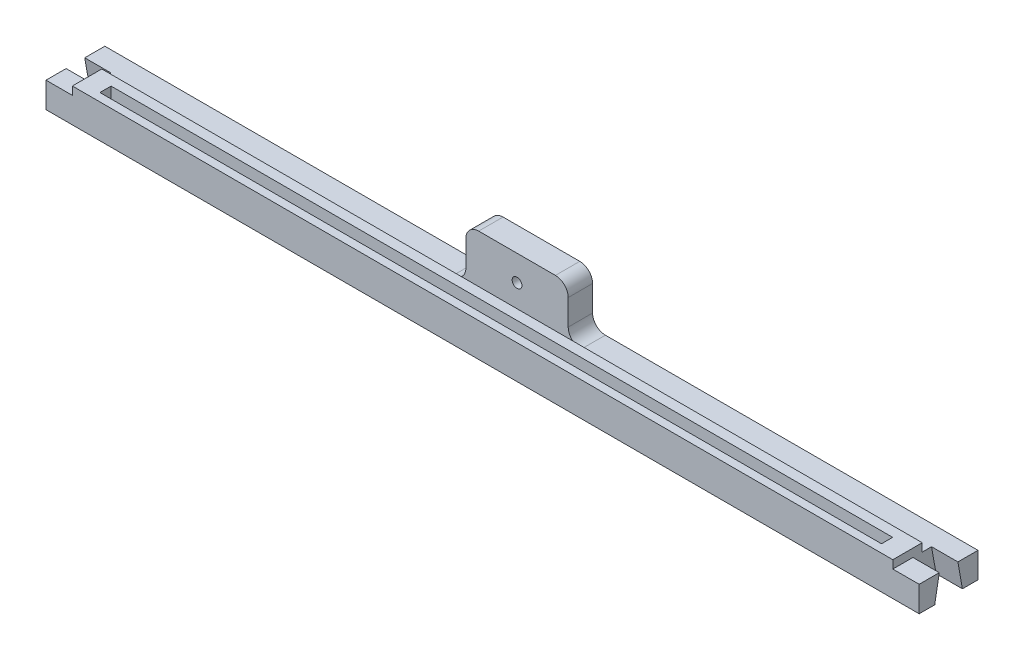
ISO-10303-21;
HEADER;
FILE_DESCRIPTION(('STEP AP214'),'2;1');
FILE_NAME('part.step','',(''),(''),'','','');
FILE_SCHEMA(('AUTOMOTIVE_DESIGN { 1 0 10303 214 1 1 1 1 }'));
ENDSEC;
DATA;
#1=APPLICATION_CONTEXT('core data for automotive mechanical design processes');
#2=APPLICATION_PROTOCOL_DEFINITION('international standard','automotive_design',2000,#1);
#3=PRODUCT_CONTEXT('',#1,'mechanical');
#4=PRODUCT('Part','Part','',(#3));
#5=PRODUCT_RELATED_PRODUCT_CATEGORY('part','',(#4));
#6=PRODUCT_DEFINITION_FORMATION('','',#4);
#7=PRODUCT_DEFINITION_CONTEXT('part definition',#1,'design');
#8=PRODUCT_DEFINITION('design','',#6,#7);
#9=PRODUCT_DEFINITION_SHAPE('','',#8);
#10=(LENGTH_UNIT() NAMED_UNIT(*) SI_UNIT(.MILLI.,.METRE.));
#11=(NAMED_UNIT(*) PLANE_ANGLE_UNIT() SI_UNIT($,.RADIAN.));
#12=(NAMED_UNIT(*) SI_UNIT($,.STERADIAN.) SOLID_ANGLE_UNIT());
#13=UNCERTAINTY_MEASURE_WITH_UNIT(LENGTH_MEASURE(1.E-05),#10,'distance_accuracy_value','');
#14=(GEOMETRIC_REPRESENTATION_CONTEXT(3) GLOBAL_UNCERTAINTY_ASSIGNED_CONTEXT((#13)) GLOBAL_UNIT_ASSIGNED_CONTEXT((#10,
#11,#12)) REPRESENTATION_CONTEXT('',''));
#15=CARTESIAN_POINT('',(0.,0.,0.));
#16=DIRECTION('',(0.,0.,1.));
#17=DIRECTION('',(1.,0.,0.));
#18=AXIS2_PLACEMENT_3D('',#15,#16,#17);
#19=CARTESIAN_POINT('',(0.,20.,0.));
#20=DIRECTION('',(0.,1.,0.));
#21=DIRECTION('',(0.,0.,1.));
#22=AXIS2_PLACEMENT_3D('',#19,#20,#21);
#23=PLANE('',#22);
#24=DIRECTION('',(1.,0.,0.));
#25=VECTOR('',#24,1.);
#26=CARTESIAN_POINT('',(0.,20.,-3.95000000000002));
#27=LINE('',#26,#25);
#28=CARTESIAN_POINT('',(-50.,20.,-3.95000000000002));
#29=VERTEX_POINT('',#28);
#30=CARTESIAN_POINT('',(50.,20.,-3.95000000000002));
#31=VERTEX_POINT('',#30);
#32=EDGE_CURVE('E256',#29,#31,#27,.T.);
#33=ORIENTED_EDGE('',*,*,#32,.F.);
#34=DIRECTION('',(0.,0.,-1.));
#35=VECTOR('',#34,1.);
#36=CARTESIAN_POINT('',(-50.,20.,-23.));
#37=LINE('',#36,#35);
#38=CARTESIAN_POINT('',(-50.,20.,-23.));
#39=VERTEX_POINT('',#38);
#40=EDGE_CURVE('E446',#29,#39,#37,.T.);
#41=ORIENTED_EDGE('',*,*,#40,.T.);
#42=DIRECTION('',(1.,0.,0.));
#43=VECTOR('',#42,1.);
#44=CARTESIAN_POINT('',(0.,20.,-23.));
#45=LINE('',#44,#43);
#46=CARTESIAN_POINT('',(-341.35,20.,-23.));
#47=VERTEX_POINT('',#46);
#48=EDGE_CURVE('E387',#47,#39,#45,.T.);
#49=ORIENTED_EDGE('',*,*,#48,.F.);
#50=DIRECTION('',(0.,0.,1.));
#51=VECTOR('',#50,1.);
#52=CARTESIAN_POINT('',(-341.35,20.,0.));
#53=LINE('',#52,#51);
#54=CARTESIAN_POINT('',(-341.35,20.,-7.291));
#55=VERTEX_POINT('',#54);
#56=EDGE_CURVE('E328',#47,#55,#53,.T.);
#57=ORIENTED_EDGE('',*,*,#56,.T.);
#58=DIRECTION('',(-1.,0.,0.));
#59=VECTOR('',#58,1.);
#60=CARTESIAN_POINT('',(0.,20.,-7.29100000000004));
#61=LINE('',#60,#59);
#62=CARTESIAN_POINT('',(-320.75,20.,-7.291));
#63=VERTEX_POINT('',#62);
#64=EDGE_CURVE('E304',#63,#55,#61,.T.);
#65=ORIENTED_EDGE('',*,*,#64,.F.);
#66=DIRECTION('',(0.,0.,1.));
#67=VECTOR('',#66,1.);
#68=CARTESIAN_POINT('',(-320.75,20.,0.));
#69=LINE('',#68,#67);
#70=CARTESIAN_POINT('',(-320.75,20.,0.));
#71=VERTEX_POINT('',#70);
#72=EDGE_CURVE('E357',#63,#71,#69,.T.);
#73=ORIENTED_EDGE('',*,*,#72,.T.);
#74=DIRECTION('',(-1.,0.,0.));
#75=VECTOR('',#74,1.);
#76=CARTESIAN_POINT('',(0.,20.,0.));
#77=LINE('',#76,#75);
#78=CARTESIAN_POINT('',(320.75,20.,0.));
#79=VERTEX_POINT('',#78);
#80=EDGE_CURVE('E301',#79,#71,#77,.T.);
#81=ORIENTED_EDGE('',*,*,#80,.F.);
#82=DIRECTION('',(0.,0.,1.));
#83=VECTOR('',#82,1.);
#84=CARTESIAN_POINT('',(320.75,20.,0.));
#85=LINE('',#84,#83);
#86=CARTESIAN_POINT('',(320.75,20.,-7.29100000000008));
#87=VERTEX_POINT('',#86);
#88=EDGE_CURVE('E373',#87,#79,#85,.T.);
#89=ORIENTED_EDGE('',*,*,#88,.F.);
#90=DIRECTION('',(1.,0.,0.));
#91=VECTOR('',#90,1.);
#92=CARTESIAN_POINT('',(0.,20.,-7.29100000000005));
#93=LINE('',#92,#91);
#94=CARTESIAN_POINT('',(341.35,20.,-7.29100000000008));
#95=VERTEX_POINT('',#94);
#96=EDGE_CURVE('E376',#87,#95,#93,.T.);
#97=ORIENTED_EDGE('',*,*,#96,.T.);
#98=DIRECTION('',(0.,0.,1.));
#99=VECTOR('',#98,1.);
#100=CARTESIAN_POINT('',(341.35,20.,0.));
#101=LINE('',#100,#99);
#102=CARTESIAN_POINT('',(341.35,20.,-23.));
#103=VERTEX_POINT('',#102);
#104=EDGE_CURVE('E384',#103,#95,#101,.T.);
#105=ORIENTED_EDGE('',*,*,#104,.F.);
#106=CARTESIAN_POINT('',(50.,20.,-23.));
#107=VERTEX_POINT('',#106);
#108=EDGE_CURVE('E386',#107,#103,#45,.T.);
#109=ORIENTED_EDGE('',*,*,#108,.F.);
#110=DIRECTION('',(0.,0.,-1.));
#111=VECTOR('',#110,1.);
#112=CARTESIAN_POINT('',(50.,20.,0.));
#113=LINE('',#112,#111);
#114=EDGE_CURVE('E444',#107,#31,#113,.F.);
#115=ORIENTED_EDGE('',*,*,#114,.T.);
#116=EDGE_LOOP('',(#33,#41,#49,#57,#65,#73,#81,#89,#97,#105,#109,#115));
#117=FACE_BOUND('',#116,.T.);
#118=ADVANCED_FACE('F34',(#117),#23,.T.);
#119=DIRECTION('',(1.,0.,0.));
#120=VECTOR('',#119,1.);
#121=CARTESIAN_POINT('',(0.,20.,23.));
#122=LINE('',#121,#120);
#123=CARTESIAN_POINT('',(-341.35,20.,23.));
#124=VERTEX_POINT('',#123);
#125=CARTESIAN_POINT('',(-320.75,20.,23.));
#126=VERTEX_POINT('',#125);
#127=EDGE_CURVE('E360',#124,#126,#122,.T.);
#128=ORIENTED_EDGE('',*,*,#127,.T.);
#129=DIRECTION('',(0.,0.,-1.));
#130=VECTOR('',#129,1.);
#131=CARTESIAN_POINT('',(-320.75,20.,0.));
#132=LINE('',#131,#130);
#133=CARTESIAN_POINT('',(-320.75,20.,7.291));
#134=VERTEX_POINT('',#133);
#135=EDGE_CURVE('E276',#126,#134,#132,.T.);
#136=ORIENTED_EDGE('',*,*,#135,.T.);
#137=DIRECTION('',(-1.,0.,0.));
#138=VECTOR('',#137,1.);
#139=CARTESIAN_POINT('',(0.,20.,7.29099999999996));
#140=LINE('',#139,#138);
#141=CARTESIAN_POINT('',(-341.35,20.,7.291));
#142=VERTEX_POINT('',#141);
#143=EDGE_CURVE('E359',#134,#142,#140,.T.);
#144=ORIENTED_EDGE('',*,*,#143,.T.);
#145=DIRECTION('',(0.,0.,1.));
#146=VECTOR('',#145,1.);
#147=CARTESIAN_POINT('',(-341.35,20.,0.));
#148=LINE('',#147,#146);
#149=EDGE_CURVE('E365',#142,#124,#148,.T.);
#150=ORIENTED_EDGE('',*,*,#149,.T.);
#151=EDGE_LOOP('',(#128,#136,#144,#150));
#152=FACE_BOUND('',#151,.T.);
#153=ADVANCED_FACE('F510',(#152),#23,.T.);
#154=DIRECTION('',(0.,0.,-1.));
#155=VECTOR('',#154,1.);
#156=CARTESIAN_POINT('',(320.75,20.,0.));
#157=LINE('',#156,#155);
#158=CARTESIAN_POINT('',(320.75,20.,23.));
#159=VERTEX_POINT('',#158);
#160=CARTESIAN_POINT('',(320.75,20.,7.29099999999992));
#161=VERTEX_POINT('',#160);
#162=EDGE_CURVE('E271',#159,#161,#157,.T.);
#163=ORIENTED_EDGE('',*,*,#162,.F.);
#164=CARTESIAN_POINT('',(341.35,20.,23.));
#165=VERTEX_POINT('',#164);
#166=EDGE_CURVE('E366',#159,#165,#122,.T.);
#167=ORIENTED_EDGE('',*,*,#166,.T.);
#168=DIRECTION('',(0.,0.,1.));
#169=VECTOR('',#168,1.);
#170=CARTESIAN_POINT('',(341.35,20.,0.));
#171=LINE('',#170,#169);
#172=CARTESIAN_POINT('',(341.35,20.,7.29099999999992));
#173=VERTEX_POINT('',#172);
#174=EDGE_CURVE('E369',#173,#165,#171,.T.);
#175=ORIENTED_EDGE('',*,*,#174,.F.);
#176=DIRECTION('',(1.,0.,0.));
#177=VECTOR('',#176,1.);
#178=CARTESIAN_POINT('',(0.,20.,7.29099999999995));
#179=LINE('',#178,#177);
#180=EDGE_CURVE('E377',#161,#173,#179,.T.);
#181=ORIENTED_EDGE('',*,*,#180,.F.);
#182=EDGE_LOOP('',(#163,#167,#175,#181));
#183=FACE_BOUND('',#182,.T.);
#184=ADVANCED_FACE('F512',(#183),#23,.T.);
#185=CARTESIAN_POINT('',(-320.75,20.,0.));
#186=DIRECTION('',(1.,0.,0.));
#187=DIRECTION('',(0.,0.,-1.));
#188=AXIS2_PLACEMENT_3D('',#185,#186,#187);
#189=PLANE('',#188);
#190=DIRECTION('',(0.,0.,1.));
#191=VECTOR('',#190,1.);
#192=CARTESIAN_POINT('',(-320.75,0.,0.));
#193=LINE('',#192,#191);
#194=CARTESIAN_POINT('',(-320.75,0.,-10.8175396141693));
#195=VERTEX_POINT('',#194);
#196=CARTESIAN_POINT('',(-320.75,0.,10.8175396141693));
#197=VERTEX_POINT('',#196);
#198=EDGE_CURVE('E319',#195,#197,#193,.T.);
#199=ORIENTED_EDGE('',*,*,#198,.T.);
#200=DIRECTION('',(0.,-0.984807753012209,0.173648177666928));
#201=VECTOR('',#200,1.);
#202=CARTESIAN_POINT('',(-320.75,21.2468344324937,7.07114944907511));
#203=LINE('',#202,#201);
#204=EDGE_CURVE('E436',#197,#134,#203,.F.);
#205=ORIENTED_EDGE('',*,*,#204,.T.);
#206=ORIENTED_EDGE('',*,*,#135,.F.);
#207=DIRECTION('',(0.,-1.,0.));
#208=VECTOR('',#207,1.);
#209=CARTESIAN_POINT('',(-320.75,26.35,23.));
#210=LINE('',#209,#208);
#211=CARTESIAN_POINT('',(-320.75,26.35,23.));
#212=VERTEX_POINT('',#211);
#213=EDGE_CURVE('E542',#212,#126,#210,.T.);
#214=ORIENTED_EDGE('',*,*,#213,.F.);
#215=DIRECTION('',(0.,0.,-1.));
#216=VECTOR('',#215,1.);
#217=CARTESIAN_POINT('',(-320.75,26.35,0.));
#218=LINE('',#217,#216);
#219=CARTESIAN_POINT('',(-320.75,26.35,0.));
#220=VERTEX_POINT('',#219);
#221=EDGE_CURVE('E278',#212,#220,#218,.T.);
#222=ORIENTED_EDGE('',*,*,#221,.T.);
#223=DIRECTION('',(0.,-1.,0.));
#224=VECTOR('',#223,1.);
#225=CARTESIAN_POINT('',(-320.75,26.35,0.));
#226=LINE('',#225,#224);
#227=EDGE_CURVE('E378',#220,#71,#226,.T.);
#228=ORIENTED_EDGE('',*,*,#227,.T.);
#229=ORIENTED_EDGE('',*,*,#72,.F.);
#230=DIRECTION('',(0.,-0.984807753012209,-0.173648177666928));
#231=VECTOR('',#230,1.);
#232=CARTESIAN_POINT('',(-320.75,21.2468344324937,-7.07114944907511));
#233=LINE('',#232,#231);
#234=EDGE_CURVE('E440',#63,#195,#233,.T.);
#235=ORIENTED_EDGE('',*,*,#234,.T.);
#236=EDGE_LOOP('',(#199,#205,#206,#214,#222,#228,#229,#235));
#237=FACE_BOUND('',#236,.T.);
#238=ADVANCED_FACE('F520',(#237),#189,.F.);
#239=CARTESIAN_POINT('',(-341.35,20.,0.));
#240=DIRECTION('',(1.,0.,0.));
#241=DIRECTION('',(0.,0.,-1.));
#242=AXIS2_PLACEMENT_3D('',#239,#240,#241);
#243=PLANE('',#242);
#244=ORIENTED_EDGE('',*,*,#149,.F.);
#245=DIRECTION('',(0.,0.984807753012209,-0.173648177666928));
#246=VECTOR('',#245,1.);
#247=CARTESIAN_POINT('',(-341.35,20.0000000000005,7.291));
#248=LINE('',#247,#246);
#249=CARTESIAN_POINT('',(-341.35,0.,10.8175396141693));
#250=VERTEX_POINT('',#249);
#251=EDGE_CURVE('E428',#142,#250,#248,.F.);
#252=ORIENTED_EDGE('',*,*,#251,.T.);
#253=DIRECTION('',(0.,0.,1.));
#254=VECTOR('',#253,1.);
#255=CARTESIAN_POINT('',(-341.35,0.,0.));
#256=LINE('',#255,#254);
#257=CARTESIAN_POINT('',(-341.35,0.,23.));
#258=VERTEX_POINT('',#257);
#259=EDGE_CURVE('E320',#250,#258,#256,.T.);
#260=ORIENTED_EDGE('',*,*,#259,.T.);
#261=DIRECTION('',(0.,-1.,0.));
#262=VECTOR('',#261,1.);
#263=CARTESIAN_POINT('',(-341.35,20.,23.));
#264=LINE('',#263,#262);
#265=EDGE_CURVE('E353',#124,#258,#264,.T.);
#266=ORIENTED_EDGE('',*,*,#265,.F.);
#267=EDGE_LOOP('',(#244,#252,#260,#266));
#268=FACE_BOUND('',#267,.T.);
#269=ADVANCED_FACE('F525',(#268),#243,.F.);
#270=CARTESIAN_POINT('',(0.,20.,23.));
#271=DIRECTION('',(0.,0.,-1.));
#272=DIRECTION('',(-1.,0.,0.));
#273=AXIS2_PLACEMENT_3D('',#270,#271,#272);
#274=PLANE('',#273);
#275=DIRECTION('',(1.,0.,0.));
#276=VECTOR('',#275,1.);
#277=CARTESIAN_POINT('',(0.,0.,23.));
#278=LINE('',#277,#276);
#279=CARTESIAN_POINT('',(341.35,0.,23.));
#280=VERTEX_POINT('',#279);
#281=EDGE_CURVE('E325',#258,#280,#278,.T.);
#282=ORIENTED_EDGE('',*,*,#281,.T.);
#283=DIRECTION('',(0.,-1.,0.));
#284=VECTOR('',#283,1.);
#285=CARTESIAN_POINT('',(341.35,20.,23.));
#286=LINE('',#285,#284);
#287=EDGE_CURVE('E350',#165,#280,#286,.T.);
#288=ORIENTED_EDGE('',*,*,#287,.F.);
#289=ORIENTED_EDGE('',*,*,#166,.F.);
#290=DIRECTION('',(0.,-1.,0.));
#291=VECTOR('',#290,1.);
#292=CARTESIAN_POINT('',(320.75,26.35,23.));
#293=LINE('',#292,#291);
#294=CARTESIAN_POINT('',(320.75,26.35,23.));
#295=VERTEX_POINT('',#294);
#296=EDGE_CURVE('E292',#295,#159,#293,.T.);
#297=ORIENTED_EDGE('',*,*,#296,.F.);
#298=DIRECTION('',(1.,0.,0.));
#299=VECTOR('',#298,1.);
#300=CARTESIAN_POINT('',(0.,26.35,23.));
#301=LINE('',#300,#299);
#302=EDGE_CURVE('E281',#212,#295,#301,.T.);
#303=ORIENTED_EDGE('',*,*,#302,.F.);
#304=ORIENTED_EDGE('',*,*,#213,.T.);
#305=ORIENTED_EDGE('',*,*,#127,.F.);
#306=ORIENTED_EDGE('',*,*,#265,.T.);
#307=EDGE_LOOP('',(#282,#288,#289,#297,#303,#304,#305,#306));
#308=FACE_BOUND('',#307,.T.);
#309=ADVANCED_FACE('F536',(#308),#274,.F.);
#310=CARTESIAN_POINT('',(341.35,20.,0.));
#311=DIRECTION('',(1.,0.,0.));
#312=DIRECTION('',(0.,0.,-1.));
#313=AXIS2_PLACEMENT_3D('',#310,#311,#312);
#314=PLANE('',#313);
#315=DIRECTION('',(0.,0.,1.));
#316=VECTOR('',#315,1.);
#317=CARTESIAN_POINT('',(341.35,0.,0.));
#318=LINE('',#317,#316);
#319=CARTESIAN_POINT('',(341.35,0.,10.8175396141692));
#320=VERTEX_POINT('',#319);
#321=EDGE_CURVE('E333',#320,#280,#318,.T.);
#322=ORIENTED_EDGE('',*,*,#321,.F.);
#323=DIRECTION('',(0.,0.984807753012209,-0.173648177666928));
#324=VECTOR('',#323,1.);
#325=CARTESIAN_POINT('',(341.35,21.2468344324937,7.07114944907504));
#326=LINE('',#325,#324);
#327=EDGE_CURVE('E426',#320,#173,#326,.T.);
#328=ORIENTED_EDGE('',*,*,#327,.T.);
#329=ORIENTED_EDGE('',*,*,#174,.T.);
#330=ORIENTED_EDGE('',*,*,#287,.T.);
#331=EDGE_LOOP('',(#322,#328,#329,#330));
#332=FACE_BOUND('',#331,.T.);
#333=ADVANCED_FACE('F711',(#332),#314,.T.);
#334=CARTESIAN_POINT('',(320.75,20.,0.));
#335=DIRECTION('',(1.,0.,0.));
#336=DIRECTION('',(0.,0.,-1.));
#337=AXIS2_PLACEMENT_3D('',#334,#335,#336);
#338=PLANE('',#337);
#339=DIRECTION('',(0.,0.,1.));
#340=VECTOR('',#339,1.);
#341=CARTESIAN_POINT('',(320.75,0.,0.));
#342=LINE('',#341,#340);
#343=CARTESIAN_POINT('',(320.75,0.,-10.8175396141694));
#344=VERTEX_POINT('',#343);
#345=CARTESIAN_POINT('',(320.75,0.,10.8175396141692));
#346=VERTEX_POINT('',#345);
#347=EDGE_CURVE('E335',#344,#346,#342,.T.);
#348=ORIENTED_EDGE('',*,*,#347,.F.);
#349=DIRECTION('',(0.,-0.984807753012209,-0.173648177666928));
#350=VECTOR('',#349,1.);
#351=CARTESIAN_POINT('',(320.75,20.0000000000005,-7.29100000000008));
#352=LINE('',#351,#350);
#353=EDGE_CURVE('E410',#344,#87,#352,.F.);
#354=ORIENTED_EDGE('',*,*,#353,.T.);
#355=ORIENTED_EDGE('',*,*,#88,.T.);
#356=DIRECTION('',(0.,-1.,0.));
#357=VECTOR('',#356,1.);
#358=CARTESIAN_POINT('',(320.75,26.35,0.));
#359=LINE('',#358,#357);
#360=CARTESIAN_POINT('',(320.75,26.35,0.));
#361=VERTEX_POINT('',#360);
#362=EDGE_CURVE('E310',#361,#79,#359,.T.);
#363=ORIENTED_EDGE('',*,*,#362,.F.);
#364=DIRECTION('',(0.,0.,-1.));
#365=VECTOR('',#364,1.);
#366=CARTESIAN_POINT('',(320.75,26.35,0.));
#367=LINE('',#366,#365);
#368=EDGE_CURVE('E272',#295,#361,#367,.T.);
#369=ORIENTED_EDGE('',*,*,#368,.F.);
#370=ORIENTED_EDGE('',*,*,#296,.T.);
#371=ORIENTED_EDGE('',*,*,#162,.T.);
#372=DIRECTION('',(0.,-0.984807753012209,0.173648177666928));
#373=VECTOR('',#372,1.);
#374=CARTESIAN_POINT('',(320.75,0.,10.8175396141692));
#375=LINE('',#374,#373);
#376=EDGE_CURVE('E433',#161,#346,#375,.T.);
#377=ORIENTED_EDGE('',*,*,#376,.T.);
#378=EDGE_LOOP('',(#348,#354,#355,#363,#369,#370,#371,#377));
#379=FACE_BOUND('',#378,.T.);
#380=ADVANCED_FACE('F540',(#379),#338,.T.);
#381=CARTESIAN_POINT('',(341.35,20.,0.));
#382=DIRECTION('',(1.,0.,0.));
#383=DIRECTION('',(0.,0.,-1.));
#384=AXIS2_PLACEMENT_3D('',#381,#382,#383);
#385=PLANE('',#384);
#386=ORIENTED_EDGE('',*,*,#104,.T.);
#387=DIRECTION('',(0.,0.984807753012209,0.173648177666928));
#388=VECTOR('',#387,1.);
#389=CARTESIAN_POINT('',(341.35,21.2468344324937,-7.07114944907519));
#390=LINE('',#389,#388);
#391=CARTESIAN_POINT('',(341.35,0.,-10.8175396141694));
#392=VERTEX_POINT('',#391);
#393=EDGE_CURVE('E356',#95,#392,#390,.F.);
#394=ORIENTED_EDGE('',*,*,#393,.T.);
#395=DIRECTION('',(0.,0.,1.));
#396=VECTOR('',#395,1.);
#397=CARTESIAN_POINT('',(341.35,0.,0.));
#398=LINE('',#397,#396);
#399=CARTESIAN_POINT('',(341.35,0.,-23.));
#400=VERTEX_POINT('',#399);
#401=EDGE_CURVE('E337',#400,#392,#398,.T.);
#402=ORIENTED_EDGE('',*,*,#401,.F.);
#403=DIRECTION('',(0.,-1.,0.));
#404=VECTOR('',#403,1.);
#405=CARTESIAN_POINT('',(341.35,20.,-23.));
#406=LINE('',#405,#404);
#407=EDGE_CURVE('E348',#103,#400,#406,.T.);
#408=ORIENTED_EDGE('',*,*,#407,.F.);
#409=EDGE_LOOP('',(#386,#394,#402,#408));
#410=FACE_BOUND('',#409,.T.);
#411=ADVANCED_FACE('F403',(#410),#385,.T.);
#412=CARTESIAN_POINT('',(0.,20.,-23.));
#413=DIRECTION('',(0.,0.,-1.));
#414=DIRECTION('',(-1.,0.,0.));
#415=AXIS2_PLACEMENT_3D('',#412,#413,#414);
#416=PLANE('',#415);
#417=CARTESIAN_POINT('',(0.,40.,-23.));
#418=DIRECTION('',(0.,0.,-1.));
#419=DIRECTION('',(-1.,0.,0.));
#420=AXIS2_PLACEMENT_3D('',#417,#418,#419);
#421=CIRCLE('',#420,3.81);
#422=CARTESIAN_POINT('',(-3.81000000000001,40.,-23.));
#423=VERTEX_POINT('',#422);
#424=EDGE_CURVE('E248',#423,#423,#421,.T.);
#425=ORIENTED_EDGE('',*,*,#424,.F.);
#426=EDGE_LOOP('',(#425));
#427=FACE_BOUND('',#426,.T.);
#428=DIRECTION('',(0.,-1.,0.));
#429=VECTOR('',#428,1.);
#430=CARTESIAN_POINT('',(-40.,60.,-23.));
#431=LINE('',#430,#429);
#432=CARTESIAN_POINT('',(-40.,50.,-23.));
#433=VERTEX_POINT('',#432);
#434=CARTESIAN_POINT('',(-40.,30.,-23.));
#435=VERTEX_POINT('',#434);
#436=EDGE_CURVE('E263',#433,#435,#431,.T.);
#437=ORIENTED_EDGE('',*,*,#436,.F.);
#438=CARTESIAN_POINT('',(-30.,50.,-23.));
#439=DIRECTION('',(0.,0.,-1.));
#440=DIRECTION('',(-1.,0.,0.));
#441=AXIS2_PLACEMENT_3D('',#438,#439,#440);
#442=CIRCLE('',#441,10.);
#443=CARTESIAN_POINT('',(-30.,60.,-23.));
#444=VERTEX_POINT('',#443);
#445=EDGE_CURVE('E456',#433,#444,#442,.T.);
#446=ORIENTED_EDGE('',*,*,#445,.T.);
#447=DIRECTION('',(-1.,0.,0.));
#448=VECTOR('',#447,1.);
#449=CARTESIAN_POINT('',(0.,60.,-23.));
#450=LINE('',#449,#448);
#451=CARTESIAN_POINT('',(30.,60.,-23.));
#452=VERTEX_POINT('',#451);
#453=EDGE_CURVE('E255',#452,#444,#450,.T.);
#454=ORIENTED_EDGE('',*,*,#453,.F.);
#455=CARTESIAN_POINT('',(30.,50.,-23.));
#456=DIRECTION('',(0.,0.,-1.));
#457=DIRECTION('',(-1.,0.,0.));
#458=AXIS2_PLACEMENT_3D('',#455,#456,#457);
#459=CIRCLE('',#458,10.);
#460=CARTESIAN_POINT('',(40.,50.,-23.));
#461=VERTEX_POINT('',#460);
#462=EDGE_CURVE('E454',#452,#461,#459,.T.);
#463=ORIENTED_EDGE('',*,*,#462,.T.);
#464=DIRECTION('',(0.,-1.,0.));
#465=VECTOR('',#464,1.);
#466=CARTESIAN_POINT('',(40.,60.,-23.));
#467=LINE('',#466,#465);
#468=CARTESIAN_POINT('',(40.,30.,-23.));
#469=VERTEX_POINT('',#468);
#470=EDGE_CURVE('E266',#461,#469,#467,.T.);
#471=ORIENTED_EDGE('',*,*,#470,.T.);
#472=CARTESIAN_POINT('',(50.,30.,-23.));
#473=DIRECTION('',(0.,0.,-1.));
#474=DIRECTION('',(-1.,0.,0.));
#475=AXIS2_PLACEMENT_3D('',#472,#473,#474);
#476=CIRCLE('',#475,10.);
#477=EDGE_CURVE('E42',#469,#107,#476,.F.);
#478=ORIENTED_EDGE('',*,*,#477,.T.);
#479=ORIENTED_EDGE('',*,*,#108,.T.);
#480=ORIENTED_EDGE('',*,*,#407,.T.);
#481=DIRECTION('',(1.,0.,0.));
#482=VECTOR('',#481,1.);
#483=CARTESIAN_POINT('',(0.,0.,-23.));
#484=LINE('',#483,#482);
#485=CARTESIAN_POINT('',(-341.35,0.,-23.));
#486=VERTEX_POINT('',#485);
#487=EDGE_CURVE('E340',#486,#400,#484,.T.);
#488=ORIENTED_EDGE('',*,*,#487,.F.);
#489=DIRECTION('',(0.,-1.,0.));
#490=VECTOR('',#489,1.);
#491=CARTESIAN_POINT('',(-341.35,20.,-23.));
#492=LINE('',#491,#490);
#493=EDGE_CURVE('E346',#47,#486,#492,.T.);
#494=ORIENTED_EDGE('',*,*,#493,.F.);
#495=ORIENTED_EDGE('',*,*,#48,.T.);
#496=CARTESIAN_POINT('',(-50.,30.,-23.));
#497=DIRECTION('',(0.,0.,-1.));
#498=DIRECTION('',(-1.,0.,0.));
#499=AXIS2_PLACEMENT_3D('',#496,#497,#498);
#500=CIRCLE('',#499,10.);
#501=EDGE_CURVE('E471',#39,#435,#500,.F.);
#502=ORIENTED_EDGE('',*,*,#501,.T.);
#503=EDGE_LOOP('',(#437,#446,#454,#463,#471,#478,#479,#480,#488,#494,#495,#502));
#504=FACE_BOUND('',#503,.T.);
#505=ADVANCED_FACE('F395',(#427,#504),#416,.T.);
#506=CARTESIAN_POINT('',(-341.35,20.,0.));
#507=DIRECTION('',(1.,0.,0.));
#508=DIRECTION('',(0.,0.,-1.));
#509=AXIS2_PLACEMENT_3D('',#506,#507,#508);
#510=PLANE('',#509);
#511=DIRECTION('',(0.,0.,1.));
#512=VECTOR('',#511,1.);
#513=CARTESIAN_POINT('',(-341.35,0.,0.));
#514=LINE('',#513,#512);
#515=CARTESIAN_POINT('',(-341.35,0.,-10.8175396141693));
#516=VERTEX_POINT('',#515);
#517=EDGE_CURVE('E343',#486,#516,#514,.T.);
#518=ORIENTED_EDGE('',*,*,#517,.T.);
#519=DIRECTION('',(0.,0.984807753012209,0.173648177666928));
#520=VECTOR('',#519,1.);
#521=CARTESIAN_POINT('',(-341.35,0.,-10.8175396141693));
#522=LINE('',#521,#520);
#523=EDGE_CURVE('E430',#516,#55,#522,.T.);
#524=ORIENTED_EDGE('',*,*,#523,.T.);
#525=ORIENTED_EDGE('',*,*,#56,.F.);
#526=ORIENTED_EDGE('',*,*,#493,.T.);
#527=EDGE_LOOP('',(#518,#524,#525,#526));
#528=FACE_BOUND('',#527,.T.);
#529=ADVANCED_FACE('F584',(#528),#510,.F.);
#530=CARTESIAN_POINT('',(0.,0.,0.));
#531=DIRECTION('',(0.,1.,0.));
#532=DIRECTION('',(0.,0.,1.));
#533=AXIS2_PLACEMENT_3D('',#530,#531,#532);
#534=PLANE('',#533);
#535=DIRECTION('',(0.,0.,1.));
#536=VECTOR('',#535,1.);
#537=CARTESIAN_POINT('',(-305.55,0.,0.));
#538=LINE('',#537,#536);
#539=CARTESIAN_POINT('',(-305.55,0.,7.91875));
#540=VERTEX_POINT('',#539);
#541=CARTESIAN_POINT('',(-305.55,0.,16.65));
#542=VERTEX_POINT('',#541);
#543=EDGE_CURVE('E243',#540,#542,#538,.T.);
#544=ORIENTED_EDGE('',*,*,#543,.T.);
#545=DIRECTION('',(1.,0.,0.));
#546=VECTOR('',#545,1.);
#547=CARTESIAN_POINT('',(0.,0.,16.65));
#548=LINE('',#547,#546);
#549=CARTESIAN_POINT('',(305.55,0.,16.65));
#550=VERTEX_POINT('',#549);
#551=EDGE_CURVE('E223',#542,#550,#548,.T.);
#552=ORIENTED_EDGE('',*,*,#551,.T.);
#553=DIRECTION('',(0.,0.,1.));
#554=VECTOR('',#553,1.);
#555=CARTESIAN_POINT('',(305.55,0.,0.));
#556=LINE('',#555,#554);
#557=CARTESIAN_POINT('',(305.55,0.,7.91875));
#558=VERTEX_POINT('',#557);
#559=EDGE_CURVE('E232',#558,#550,#556,.T.);
#560=ORIENTED_EDGE('',*,*,#559,.F.);
#561=DIRECTION('',(1.,0.,0.));
#562=VECTOR('',#561,1.);
#563=CARTESIAN_POINT('',(0.,0.,7.91875));
#564=LINE('',#563,#562);
#565=EDGE_CURVE('E238',#540,#558,#564,.T.);
#566=ORIENTED_EDGE('',*,*,#565,.F.);
#567=EDGE_LOOP('',(#544,#552,#560,#566));
#568=FACE_BOUND('',#567,.T.);
#569=ORIENTED_EDGE('',*,*,#401,.T.);
#570=DIRECTION('',(-1.,0.,0.));
#571=VECTOR('',#570,1.);
#572=CARTESIAN_POINT('',(0.,0.,-10.8175396141694));
#573=LINE('',#572,#571);
#574=EDGE_CURVE('E412',#392,#344,#573,.T.);
#575=ORIENTED_EDGE('',*,*,#574,.T.);
#576=ORIENTED_EDGE('',*,*,#347,.T.);
#577=DIRECTION('',(1.,0.,0.));
#578=VECTOR('',#577,1.);
#579=CARTESIAN_POINT('',(341.35,0.,10.8175396141692));
#580=LINE('',#579,#578);
#581=EDGE_CURVE('E422',#346,#320,#580,.T.);
#582=ORIENTED_EDGE('',*,*,#581,.T.);
#583=ORIENTED_EDGE('',*,*,#321,.T.);
#584=ORIENTED_EDGE('',*,*,#281,.F.);
#585=ORIENTED_EDGE('',*,*,#259,.F.);
#586=DIRECTION('',(1.,0.,0.));
#587=VECTOR('',#586,1.);
#588=CARTESIAN_POINT('',(0.,0.,10.8175396141693));
#589=LINE('',#588,#587);
#590=EDGE_CURVE('E416',#250,#197,#589,.T.);
#591=ORIENTED_EDGE('',*,*,#590,.T.);
#592=ORIENTED_EDGE('',*,*,#198,.F.);
#593=DIRECTION('',(-1.,0.,0.));
#594=VECTOR('',#593,1.);
#595=CARTESIAN_POINT('',(-341.35,0.,-10.8175396141693));
#596=LINE('',#595,#594);
#597=EDGE_CURVE('E413',#195,#516,#596,.T.);
#598=ORIENTED_EDGE('',*,*,#597,.T.);
#599=ORIENTED_EDGE('',*,*,#517,.F.);
#600=ORIENTED_EDGE('',*,*,#487,.T.);
#601=EDGE_LOOP('',(#569,#575,#576,#582,#583,#584,#585,#591,#592,#598,#599,#600));
#602=FACE_BOUND('',#601,.T.);
#603=ADVANCED_FACE('F240',(#568,#602),#534,.F.);
#604=CARTESIAN_POINT('',(0.,26.35,7.91875));
#605=DIRECTION('',(0.,0.,-1.));
#606=DIRECTION('',(-1.,0.,0.));
#607=AXIS2_PLACEMENT_3D('',#604,#605,#606);
#608=PLANE('',#607);
#609=DIRECTION('',(0.,-1.,0.));
#610=VECTOR('',#609,1.);
#611=CARTESIAN_POINT('',(-305.55,26.35,7.91875));
#612=LINE('',#611,#610);
#613=CARTESIAN_POINT('',(-305.55,26.35,7.91875));
#614=VERTEX_POINT('',#613);
#615=EDGE_CURVE('E308',#614,#540,#612,.T.);
#616=ORIENTED_EDGE('',*,*,#615,.T.);
#617=ORIENTED_EDGE('',*,*,#565,.T.);
#618=DIRECTION('',(0.,-1.,0.));
#619=VECTOR('',#618,1.);
#620=CARTESIAN_POINT('',(305.55,26.35,7.91875));
#621=LINE('',#620,#619);
#622=CARTESIAN_POINT('',(305.55,26.35,7.91875));
#623=VERTEX_POINT('',#622);
#624=EDGE_CURVE('E228',#623,#558,#621,.T.);
#625=ORIENTED_EDGE('',*,*,#624,.F.);
#626=DIRECTION('',(1.,0.,0.));
#627=VECTOR('',#626,1.);
#628=CARTESIAN_POINT('',(0.,26.35,7.91875));
#629=LINE('',#628,#627);
#630=EDGE_CURVE('E283',#614,#623,#629,.T.);
#631=ORIENTED_EDGE('',*,*,#630,.F.);
#632=EDGE_LOOP('',(#616,#617,#625,#631));
#633=FACE_BOUND('',#632,.T.);
#634=ADVANCED_FACE('F318',(#633),#608,.F.);
#635=CARTESIAN_POINT('',(305.55,26.35,0.));
#636=DIRECTION('',(1.,0.,0.));
#637=DIRECTION('',(0.,0.,-1.));
#638=AXIS2_PLACEMENT_3D('',#635,#636,#637);
#639=PLANE('',#638);
#640=ORIENTED_EDGE('',*,*,#624,.T.);
#641=ORIENTED_EDGE('',*,*,#559,.T.);
#642=DIRECTION('',(0.,-1.,0.));
#643=VECTOR('',#642,1.);
#644=CARTESIAN_POINT('',(305.55,26.35,16.65));
#645=LINE('',#644,#643);
#646=CARTESIAN_POINT('',(305.55,26.35,16.65));
#647=VERTEX_POINT('',#646);
#648=EDGE_CURVE('E219',#647,#550,#645,.T.);
#649=ORIENTED_EDGE('',*,*,#648,.F.);
#650=DIRECTION('',(0.,0.,1.));
#651=VECTOR('',#650,1.);
#652=CARTESIAN_POINT('',(305.55,26.35,0.));
#653=LINE('',#652,#651);
#654=EDGE_CURVE('E286',#623,#647,#653,.T.);
#655=ORIENTED_EDGE('',*,*,#654,.F.);
#656=EDGE_LOOP('',(#640,#641,#649,#655));
#657=FACE_BOUND('',#656,.T.);
#658=ADVANCED_FACE('F233',(#657),#639,.F.);
#659=CARTESIAN_POINT('',(0.,26.35,16.65));
#660=DIRECTION('',(0.,0.,-1.));
#661=DIRECTION('',(-1.,0.,0.));
#662=AXIS2_PLACEMENT_3D('',#659,#660,#661);
#663=PLANE('',#662);
#664=ORIENTED_EDGE('',*,*,#648,.T.);
#665=ORIENTED_EDGE('',*,*,#551,.F.);
#666=DIRECTION('',(0.,-1.,0.));
#667=VECTOR('',#666,1.);
#668=CARTESIAN_POINT('',(-305.55,26.35,16.65));
#669=LINE('',#668,#667);
#670=CARTESIAN_POINT('',(-305.55,26.35,16.65));
#671=VERTEX_POINT('',#670);
#672=EDGE_CURVE('E229',#671,#542,#669,.T.);
#673=ORIENTED_EDGE('',*,*,#672,.F.);
#674=DIRECTION('',(1.,0.,0.));
#675=VECTOR('',#674,1.);
#676=CARTESIAN_POINT('',(0.,26.35,16.65));
#677=LINE('',#676,#675);
#678=EDGE_CURVE('E226',#671,#647,#677,.T.);
#679=ORIENTED_EDGE('',*,*,#678,.T.);
#680=EDGE_LOOP('',(#664,#665,#673,#679));
#681=FACE_BOUND('',#680,.T.);
#682=ADVANCED_FACE('F221',(#681),#663,.T.);
#683=CARTESIAN_POINT('',(0.,26.35,0.));
#684=DIRECTION('',(0.,0.,1.));
#685=DIRECTION('',(1.,0.,0.));
#686=AXIS2_PLACEMENT_3D('',#683,#684,#685);
#687=PLANE('',#686);
#688=ORIENTED_EDGE('',*,*,#80,.T.);
#689=ORIENTED_EDGE('',*,*,#227,.F.);
#690=DIRECTION('',(-1.,0.,0.));
#691=VECTOR('',#690,1.);
#692=CARTESIAN_POINT('',(0.,26.35,0.));
#693=LINE('',#692,#691);
#694=EDGE_CURVE('E275',#361,#220,#693,.T.);
#695=ORIENTED_EDGE('',*,*,#694,.F.);
#696=ORIENTED_EDGE('',*,*,#362,.T.);
#697=EDGE_LOOP('',(#688,#689,#695,#696));
#698=FACE_BOUND('',#697,.T.);
#699=ADVANCED_FACE('F577',(#698),#687,.F.);
#700=CARTESIAN_POINT('',(-305.55,26.35,0.));
#701=DIRECTION('',(1.,0.,0.));
#702=DIRECTION('',(0.,0.,-1.));
#703=AXIS2_PLACEMENT_3D('',#700,#701,#702);
#704=PLANE('',#703);
#705=ORIENTED_EDGE('',*,*,#672,.T.);
#706=ORIENTED_EDGE('',*,*,#543,.F.);
#707=ORIENTED_EDGE('',*,*,#615,.F.);
#708=DIRECTION('',(0.,0.,1.));
#709=VECTOR('',#708,1.);
#710=CARTESIAN_POINT('',(-305.55,26.35,0.));
#711=LINE('',#710,#709);
#712=EDGE_CURVE('E289',#614,#671,#711,.T.);
#713=ORIENTED_EDGE('',*,*,#712,.T.);
#714=EDGE_LOOP('',(#705,#706,#707,#713));
#715=FACE_BOUND('',#714,.T.);
#716=ADVANCED_FACE('F312',(#715),#704,.T.);
#717=CARTESIAN_POINT('',(0.,26.35,0.));
#718=DIRECTION('',(0.,1.,0.));
#719=DIRECTION('',(0.,0.,1.));
#720=AXIS2_PLACEMENT_3D('',#717,#718,#719);
#721=PLANE('',#720);
#722=ORIENTED_EDGE('',*,*,#368,.T.);
#723=ORIENTED_EDGE('',*,*,#694,.T.);
#724=ORIENTED_EDGE('',*,*,#221,.F.);
#725=ORIENTED_EDGE('',*,*,#302,.T.);
#726=EDGE_LOOP('',(#722,#723,#724,#725));
#727=FACE_BOUND('',#726,.T.);
#728=ORIENTED_EDGE('',*,*,#630,.T.);
#729=ORIENTED_EDGE('',*,*,#654,.T.);
#730=ORIENTED_EDGE('',*,*,#678,.F.);
#731=ORIENTED_EDGE('',*,*,#712,.F.);
#732=EDGE_LOOP('',(#728,#729,#730,#731));
#733=FACE_BOUND('',#732,.T.);
#734=ADVANCED_FACE('F315',(#727,#733),#721,.T.);
#735=CARTESIAN_POINT('',(0.,60.,-3.95000000000002));
#736=DIRECTION('',(0.,0.,-1.));
#737=DIRECTION('',(-1.,0.,0.));
#738=AXIS2_PLACEMENT_3D('',#735,#736,#737);
#739=PLANE('',#738);
#740=CARTESIAN_POINT('',(0.,40.,-3.95000000000002));
#741=DIRECTION('',(0.,0.,-1.));
#742=DIRECTION('',(-1.,0.,0.));
#743=AXIS2_PLACEMENT_3D('',#740,#741,#742);
#744=CIRCLE('',#743,3.81);
#745=CARTESIAN_POINT('',(-3.81000000000001,40.,-3.95000000000002));
#746=VERTEX_POINT('',#745);
#747=EDGE_CURVE('E251',#746,#746,#744,.T.);
#748=ORIENTED_EDGE('',*,*,#747,.T.);
#749=EDGE_LOOP('',(#748));
#750=FACE_BOUND('',#749,.T.);
#751=DIRECTION('',(1.,0.,0.));
#752=VECTOR('',#751,1.);
#753=CARTESIAN_POINT('',(0.,60.,-3.95000000000002));
#754=LINE('',#753,#752);
#755=CARTESIAN_POINT('',(-30.,60.,-3.95000000000002));
#756=VERTEX_POINT('',#755);
#757=CARTESIAN_POINT('',(30.,60.,-3.95000000000002));
#758=VERTEX_POINT('',#757);
#759=EDGE_CURVE('E252',#756,#758,#754,.T.);
#760=ORIENTED_EDGE('',*,*,#759,.F.);
#761=CARTESIAN_POINT('',(-30.,50.,-3.95000000000002));
#762=DIRECTION('',(0.,0.,-1.));
#763=DIRECTION('',(-1.,0.,0.));
#764=AXIS2_PLACEMENT_3D('',#761,#762,#763);
#765=CIRCLE('',#764,10.);
#766=CARTESIAN_POINT('',(-40.,50.,-3.95000000000002));
#767=VERTEX_POINT('',#766);
#768=EDGE_CURVE('E465',#756,#767,#765,.F.);
#769=ORIENTED_EDGE('',*,*,#768,.T.);
#770=DIRECTION('',(0.,-1.,0.));
#771=VECTOR('',#770,1.);
#772=CARTESIAN_POINT('',(-40.,60.,-3.95000000000002));
#773=LINE('',#772,#771);
#774=CARTESIAN_POINT('',(-40.,30.,-3.95000000000002));
#775=VERTEX_POINT('',#774);
#776=EDGE_CURVE('E259',#767,#775,#773,.T.);
#777=ORIENTED_EDGE('',*,*,#776,.T.);
#778=CARTESIAN_POINT('',(-50.,30.,-3.95000000000002));
#779=DIRECTION('',(0.,0.,-1.));
#780=DIRECTION('',(-1.,0.,0.));
#781=AXIS2_PLACEMENT_3D('',#778,#779,#780);
#782=CIRCLE('',#781,10.);
#783=EDGE_CURVE('E473',#775,#29,#782,.T.);
#784=ORIENTED_EDGE('',*,*,#783,.T.);
#785=ORIENTED_EDGE('',*,*,#32,.T.);
#786=CARTESIAN_POINT('',(50.,30.,-3.95000000000002));
#787=DIRECTION('',(0.,0.,-1.));
#788=DIRECTION('',(-1.,0.,0.));
#789=AXIS2_PLACEMENT_3D('',#786,#787,#788);
#790=CIRCLE('',#789,10.);
#791=CARTESIAN_POINT('',(40.,30.,-3.95000000000002));
#792=VERTEX_POINT('',#791);
#793=EDGE_CURVE('E11',#31,#792,#790,.T.);
#794=ORIENTED_EDGE('',*,*,#793,.T.);
#795=DIRECTION('',(0.,-1.,0.));
#796=VECTOR('',#795,1.);
#797=CARTESIAN_POINT('',(40.,60.,-3.95000000000002));
#798=LINE('',#797,#796);
#799=CARTESIAN_POINT('',(40.,50.,-3.95000000000002));
#800=VERTEX_POINT('',#799);
#801=EDGE_CURVE('E269',#800,#792,#798,.T.);
#802=ORIENTED_EDGE('',*,*,#801,.F.);
#803=CARTESIAN_POINT('',(30.,50.,-3.95000000000002));
#804=DIRECTION('',(0.,0.,-1.));
#805=DIRECTION('',(-1.,0.,0.));
#806=AXIS2_PLACEMENT_3D('',#803,#804,#805);
#807=CIRCLE('',#806,10.);
#808=EDGE_CURVE('E463',#800,#758,#807,.F.);
#809=ORIENTED_EDGE('',*,*,#808,.T.);
#810=EDGE_LOOP('',(#760,#769,#777,#784,#785,#794,#802,#809));
#811=FACE_BOUND('',#810,.T.);
#812=ADVANCED_FACE('F478',(#750,#811),#739,.F.);
#813=CARTESIAN_POINT('',(40.,60.,0.));
#814=DIRECTION('',(-1.,0.,0.));
#815=DIRECTION('',(0.,0.,1.));
#816=AXIS2_PLACEMENT_3D('',#813,#814,#815);
#817=PLANE('',#816);
#818=ORIENTED_EDGE('',*,*,#470,.F.);
#819=DIRECTION('',(0.,0.,-1.));
#820=VECTOR('',#819,1.);
#821=CARTESIAN_POINT('',(40.,50.,-3.95000000000002));
#822=LINE('',#821,#820);
#823=EDGE_CURVE('E54',#461,#800,#822,.F.);
#824=ORIENTED_EDGE('',*,*,#823,.T.);
#825=ORIENTED_EDGE('',*,*,#801,.T.);
#826=DIRECTION('',(0.,0.,-1.));
#827=VECTOR('',#826,1.);
#828=CARTESIAN_POINT('',(40.,30.,0.));
#829=LINE('',#828,#827);
#830=EDGE_CURVE('E467',#792,#469,#829,.T.);
#831=ORIENTED_EDGE('',*,*,#830,.T.);
#832=EDGE_LOOP('',(#818,#824,#825,#831));
#833=FACE_BOUND('',#832,.T.);
#834=ADVANCED_FACE('F485',(#833),#817,.F.);
#835=CARTESIAN_POINT('',(-40.,60.,0.));
#836=DIRECTION('',(-1.,0.,0.));
#837=DIRECTION('',(0.,0.,1.));
#838=AXIS2_PLACEMENT_3D('',#835,#836,#837);
#839=PLANE('',#838);
#840=ORIENTED_EDGE('',*,*,#436,.T.);
#841=DIRECTION('',(0.,0.,-1.));
#842=VECTOR('',#841,1.);
#843=CARTESIAN_POINT('',(-40.,30.,-3.95000000000002));
#844=LINE('',#843,#842);
#845=EDGE_CURVE('E452',#435,#775,#844,.F.);
#846=ORIENTED_EDGE('',*,*,#845,.T.);
#847=ORIENTED_EDGE('',*,*,#776,.F.);
#848=DIRECTION('',(0.,0.,-1.));
#849=VECTOR('',#848,1.);
#850=CARTESIAN_POINT('',(-40.,50.,0.));
#851=LINE('',#850,#849);
#852=EDGE_CURVE('E449',#767,#433,#851,.T.);
#853=ORIENTED_EDGE('',*,*,#852,.T.);
#854=EDGE_LOOP('',(#840,#846,#847,#853));
#855=FACE_BOUND('',#854,.T.);
#856=ADVANCED_FACE('F499',(#855),#839,.T.);
#857=CARTESIAN_POINT('',(0.,60.,0.));
#858=DIRECTION('',(0.,1.,0.));
#859=DIRECTION('',(0.,0.,1.));
#860=AXIS2_PLACEMENT_3D('',#857,#858,#859);
#861=PLANE('',#860);
#862=ORIENTED_EDGE('',*,*,#453,.T.);
#863=DIRECTION('',(0.,0.,-1.));
#864=VECTOR('',#863,1.);
#865=CARTESIAN_POINT('',(-30.,60.,0.));
#866=LINE('',#865,#864);
#867=EDGE_CURVE('E461',#444,#756,#866,.F.);
#868=ORIENTED_EDGE('',*,*,#867,.T.);
#869=ORIENTED_EDGE('',*,*,#759,.T.);
#870=DIRECTION('',(0.,0.,-1.));
#871=VECTOR('',#870,1.);
#872=CARTESIAN_POINT('',(30.,60.,-23.));
#873=LINE('',#872,#871);
#874=EDGE_CURVE('E458',#758,#452,#873,.T.);
#875=ORIENTED_EDGE('',*,*,#874,.T.);
#876=EDGE_LOOP('',(#862,#868,#869,#875));
#877=FACE_BOUND('',#876,.T.);
#878=ADVANCED_FACE('F492',(#877),#861,.T.);
#879=CARTESIAN_POINT('',(0.,40.,27.8));
#880=DIRECTION('',(0.,0.,-1.));
#881=DIRECTION('',(-1.,0.,0.));
#882=AXIS2_PLACEMENT_3D('',#879,#880,#881);
#883=CYLINDRICAL_SURFACE('',#882,3.81);
#884=ORIENTED_EDGE('',*,*,#424,.T.);
#885=EDGE_LOOP('',(#884));
#886=FACE_BOUND('',#885,.T.);
#887=ORIENTED_EDGE('',*,*,#747,.F.);
#888=EDGE_LOOP('',(#887));
#889=FACE_BOUND('',#888,.T.);
#890=ADVANCED_FACE('F506',(#886,#889),#883,.F.);
#891=CARTESIAN_POINT('',(0.,20.0000000000005,-7.29100000000005));
#892=DIRECTION('',(0.,0.173648177666928,-0.984807753012209));
#893=DIRECTION('',(1.,0.,0.));
#894=AXIS2_PLACEMENT_3D('',#891,#892,#893);
#895=PLANE('',#894);
#896=ORIENTED_EDGE('',*,*,#353,.F.);
#897=ORIENTED_EDGE('',*,*,#574,.F.);
#898=ORIENTED_EDGE('',*,*,#393,.F.);
#899=ORIENTED_EDGE('',*,*,#96,.F.);
#900=EDGE_LOOP('',(#896,#897,#898,#899));
#901=FACE_BOUND('',#900,.T.);
#902=ADVANCED_FACE('F408',(#901),#895,.F.);
#903=CARTESIAN_POINT('',(0.,0.,10.8175396141693));
#904=DIRECTION('',(0.,-0.173648177666928,-0.984807753012209));
#905=DIRECTION('',(-1.,0.,0.));
#906=AXIS2_PLACEMENT_3D('',#903,#904,#905);
#907=PLANE('',#906);
#908=ORIENTED_EDGE('',*,*,#376,.F.);
#909=ORIENTED_EDGE('',*,*,#180,.T.);
#910=ORIENTED_EDGE('',*,*,#327,.F.);
#911=ORIENTED_EDGE('',*,*,#581,.F.);
#912=EDGE_LOOP('',(#908,#909,#910,#911));
#913=FACE_BOUND('',#912,.T.);
#914=ADVANCED_FACE('F702',(#913),#907,.T.);
#915=CARTESIAN_POINT('',(0.,20.0000000000005,7.29099999999996));
#916=DIRECTION('',(0.,0.173648177666928,0.984807753012209));
#917=DIRECTION('',(-1.,0.,0.));
#918=AXIS2_PLACEMENT_3D('',#915,#916,#917);
#919=PLANE('',#918);
#920=ORIENTED_EDGE('',*,*,#204,.F.);
#921=ORIENTED_EDGE('',*,*,#590,.F.);
#922=ORIENTED_EDGE('',*,*,#251,.F.);
#923=ORIENTED_EDGE('',*,*,#143,.F.);
#924=EDGE_LOOP('',(#920,#921,#922,#923));
#925=FACE_BOUND('',#924,.T.);
#926=ADVANCED_FACE('F699',(#925),#919,.F.);
#927=CARTESIAN_POINT('',(0.,0.,-10.8175396141694));
#928=DIRECTION('',(0.,-0.173648177666928,0.984807753012209));
#929=DIRECTION('',(1.,0.,0.));
#930=AXIS2_PLACEMENT_3D('',#927,#928,#929);
#931=PLANE('',#930);
#932=ORIENTED_EDGE('',*,*,#234,.F.);
#933=ORIENTED_EDGE('',*,*,#64,.T.);
#934=ORIENTED_EDGE('',*,*,#523,.F.);
#935=ORIENTED_EDGE('',*,*,#597,.F.);
#936=EDGE_LOOP('',(#932,#933,#934,#935));
#937=FACE_BOUND('',#936,.T.);
#938=ADVANCED_FACE('F588',(#937),#931,.T.);
#939=CARTESIAN_POINT('',(-50.,30.,0.));
#940=DIRECTION('',(0.,0.,1.));
#941=DIRECTION('',(1.,0.,0.));
#942=AXIS2_PLACEMENT_3D('',#939,#940,#941);
#943=CYLINDRICAL_SURFACE('',#942,10.);
#944=ORIENTED_EDGE('',*,*,#783,.F.);
#945=ORIENTED_EDGE('',*,*,#845,.F.);
#946=ORIENTED_EDGE('',*,*,#501,.F.);
#947=ORIENTED_EDGE('',*,*,#40,.F.);
#948=EDGE_LOOP('',(#944,#945,#946,#947));
#949=FACE_BOUND('',#948,.T.);
#950=ADVANCED_FACE('F482',(#949),#943,.F.);
#951=CARTESIAN_POINT('',(-30.,50.,0.));
#952=DIRECTION('',(0.,0.,-1.));
#953=DIRECTION('',(-1.,0.,0.));
#954=AXIS2_PLACEMENT_3D('',#951,#952,#953);
#955=CYLINDRICAL_SURFACE('',#954,10.);
#956=ORIENTED_EDGE('',*,*,#768,.F.);
#957=ORIENTED_EDGE('',*,*,#867,.F.);
#958=ORIENTED_EDGE('',*,*,#445,.F.);
#959=ORIENTED_EDGE('',*,*,#852,.F.);
#960=EDGE_LOOP('',(#956,#957,#958,#959));
#961=FACE_BOUND('',#960,.T.);
#962=ADVANCED_FACE('F497',(#961),#955,.T.);
#963=CARTESIAN_POINT('',(30.,50.,0.));
#964=DIRECTION('',(0.,0.,1.));
#965=DIRECTION('',(1.,0.,0.));
#966=AXIS2_PLACEMENT_3D('',#963,#964,#965);
#967=CYLINDRICAL_SURFACE('',#966,10.);
#968=ORIENTED_EDGE('',*,*,#808,.F.);
#969=ORIENTED_EDGE('',*,*,#823,.F.);
#970=ORIENTED_EDGE('',*,*,#462,.F.);
#971=ORIENTED_EDGE('',*,*,#874,.F.);
#972=EDGE_LOOP('',(#968,#969,#970,#971));
#973=FACE_BOUND('',#972,.T.);
#974=ADVANCED_FACE('F490',(#973),#967,.T.);
#975=CARTESIAN_POINT('',(50.,30.,0.));
#976=DIRECTION('',(0.,0.,-1.));
#977=DIRECTION('',(-1.,0.,0.));
#978=AXIS2_PLACEMENT_3D('',#975,#976,#977);
#979=CYLINDRICAL_SURFACE('',#978,10.);
#980=ORIENTED_EDGE('',*,*,#793,.F.);
#981=ORIENTED_EDGE('',*,*,#114,.F.);
#982=ORIENTED_EDGE('',*,*,#477,.F.);
#983=ORIENTED_EDGE('',*,*,#830,.F.);
#984=EDGE_LOOP('',(#980,#981,#982,#983));
#985=FACE_BOUND('',#984,.T.);
#986=ADVANCED_FACE('F36',(#985),#979,.F.);
#987=CLOSED_SHELL('',(#118,#153,#184,#238,#269,#309,#333,#380,#411,#505,#529,#603,#634,#658,
#682,#699,#716,#734,#812,#834,#856,#878,#890,#902,#914,#926,#938,#950,#962,#974,#986));
#988=MANIFOLD_SOLID_BREP('B2',#987);
#989=ADVANCED_BREP_SHAPE_REPRESENTATION('',(#18,#988),#14);
#990=SHAPE_DEFINITION_REPRESENTATION(#9,#989);
ENDSEC;
END-ISO-10303-21;
